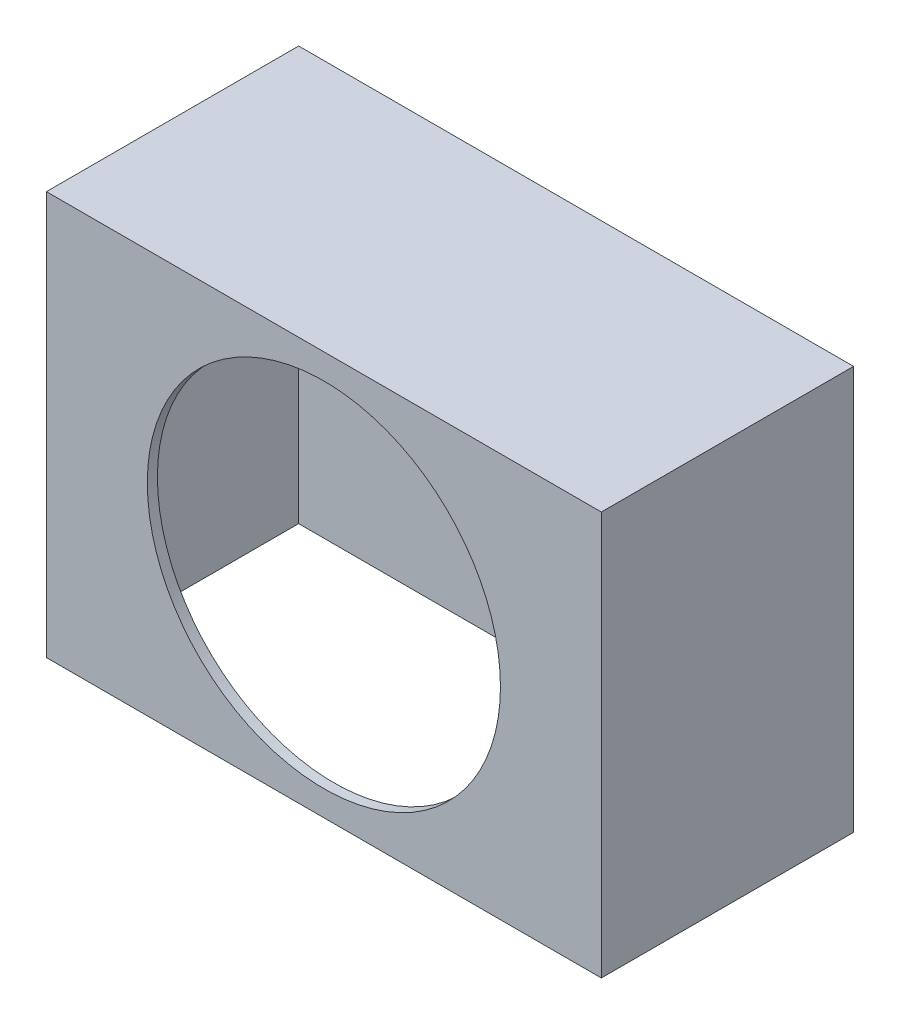
ISO-10303-21;
HEADER;
FILE_DESCRIPTION(('STEP AP214'),'2;1');
FILE_NAME('part.step','',(''),(''),'','','');
FILE_SCHEMA(('AUTOMOTIVE_DESIGN { 1 0 10303 214 1 1 1 1 }'));
ENDSEC;
DATA;
#1=APPLICATION_CONTEXT('core data for automotive mechanical design processes');
#2=APPLICATION_PROTOCOL_DEFINITION('international standard','automotive_design',2000,#1);
#3=PRODUCT_CONTEXT('',#1,'mechanical');
#4=PRODUCT('Part','Part','',(#3));
#5=PRODUCT_RELATED_PRODUCT_CATEGORY('part','',(#4));
#6=PRODUCT_DEFINITION_FORMATION('','',#4);
#7=PRODUCT_DEFINITION_CONTEXT('part definition',#1,'design');
#8=PRODUCT_DEFINITION('design','',#6,#7);
#9=PRODUCT_DEFINITION_SHAPE('','',#8);
#10=(LENGTH_UNIT() NAMED_UNIT(*) SI_UNIT(.MILLI.,.METRE.));
#11=(NAMED_UNIT(*) PLANE_ANGLE_UNIT() SI_UNIT($,.RADIAN.));
#12=(NAMED_UNIT(*) SI_UNIT($,.STERADIAN.) SOLID_ANGLE_UNIT());
#13=UNCERTAINTY_MEASURE_WITH_UNIT(LENGTH_MEASURE(1.E-05),#10,'distance_accuracy_value','');
#14=(GEOMETRIC_REPRESENTATION_CONTEXT(3) GLOBAL_UNCERTAINTY_ASSIGNED_CONTEXT((#13)) GLOBAL_UNIT_ASSIGNED_CONTEXT((#10,
#11,#12)) REPRESENTATION_CONTEXT('',''));
#15=CARTESIAN_POINT('',(0.,0.,0.));
#16=DIRECTION('',(0.,0.,1.));
#17=DIRECTION('',(1.,0.,0.));
#18=AXIS2_PLACEMENT_3D('',#15,#16,#17);
#19=CARTESIAN_POINT('',(-55.,80.,25.));
#20=DIRECTION('',(1.,0.,0.));
#21=DIRECTION('',(0.,0.,-1.));
#22=AXIS2_PLACEMENT_3D('',#19,#20,#21);
#23=PLANE('',#22);
#24=DIRECTION('',(0.,0.,1.));
#25=VECTOR('',#24,1.);
#26=CARTESIAN_POINT('',(-55.,0.,25.));
#27=LINE('',#26,#25);
#28=CARTESIAN_POINT('',(-55.,0.,-25.));
#29=VERTEX_POINT('',#28);
#30=CARTESIAN_POINT('',(-55.,0.,25.));
#31=VERTEX_POINT('',#30);
#32=EDGE_CURVE('E130',#29,#31,#27,.T.);
#33=ORIENTED_EDGE('',*,*,#32,.T.);
#34=DIRECTION('',(0.,-1.,0.));
#35=VECTOR('',#34,1.);
#36=CARTESIAN_POINT('',(-55.,80.,25.));
#37=LINE('',#36,#35);
#38=CARTESIAN_POINT('',(-55.,80.,25.));
#39=VERTEX_POINT('',#38);
#40=EDGE_CURVE('E11',#39,#31,#37,.T.);
#41=ORIENTED_EDGE('',*,*,#40,.F.);
#42=DIRECTION('',(0.,0.,1.));
#43=VECTOR('',#42,1.);
#44=CARTESIAN_POINT('',(-55.,80.,25.));
#45=LINE('',#44,#43);
#46=CARTESIAN_POINT('',(-55.,80.,-25.));
#47=VERTEX_POINT('',#46);
#48=EDGE_CURVE('E154',#47,#39,#45,.T.);
#49=ORIENTED_EDGE('',*,*,#48,.F.);
#50=DIRECTION('',(0.,-1.,0.));
#51=VECTOR('',#50,1.);
#52=CARTESIAN_POINT('',(-55.,80.,-25.));
#53=LINE('',#52,#51);
#54=EDGE_CURVE('E159',#47,#29,#53,.T.);
#55=ORIENTED_EDGE('',*,*,#54,.T.);
#56=EDGE_LOOP('',(#33,#41,#49,#55));
#57=FACE_BOUND('',#56,.T.);
#58=ADVANCED_FACE('F34',(#57),#23,.F.);
#59=CARTESIAN_POINT('',(55.,80.,25.));
#60=DIRECTION('',(0.,0.,-1.));
#61=DIRECTION('',(-1.,0.,0.));
#62=AXIS2_PLACEMENT_3D('',#59,#60,#61);
#63=PLANE('',#62);
#64=CARTESIAN_POINT('',(0.,40.,25.));
#65=DIRECTION('',(0.,0.,1.));
#66=DIRECTION('',(1.,0.,0.));
#67=AXIS2_PLACEMENT_3D('',#64,#65,#66);
#68=CIRCLE('',#67,35.);
#69=CARTESIAN_POINT('',(35.,40.,25.));
#70=VERTEX_POINT('',#69);
#71=EDGE_CURVE('E139',#70,#70,#68,.T.);
#72=ORIENTED_EDGE('',*,*,#71,.F.);
#73=EDGE_LOOP('',(#72));
#74=FACE_BOUND('',#73,.T.);
#75=DIRECTION('',(1.,0.,0.));
#76=VECTOR('',#75,1.);
#77=CARTESIAN_POINT('',(55.,0.,25.));
#78=LINE('',#77,#76);
#79=CARTESIAN_POINT('',(55.,0.,25.));
#80=VERTEX_POINT('',#79);
#81=EDGE_CURVE('E134',#31,#80,#78,.T.);
#82=ORIENTED_EDGE('',*,*,#81,.T.);
#83=DIRECTION('',(0.,-1.,0.));
#84=VECTOR('',#83,1.);
#85=CARTESIAN_POINT('',(55.,80.,25.));
#86=LINE('',#85,#84);
#87=CARTESIAN_POINT('',(55.,80.,25.));
#88=VERTEX_POINT('',#87);
#89=EDGE_CURVE('E41',#88,#80,#86,.T.);
#90=ORIENTED_EDGE('',*,*,#89,.F.);
#91=DIRECTION('',(1.,0.,0.));
#92=VECTOR('',#91,1.);
#93=CARTESIAN_POINT('',(55.,80.,25.));
#94=LINE('',#93,#92);
#95=EDGE_CURVE('E85',#39,#88,#94,.T.);
#96=ORIENTED_EDGE('',*,*,#95,.F.);
#97=ORIENTED_EDGE('',*,*,#40,.T.);
#98=EDGE_LOOP('',(#82,#90,#96,#97));
#99=FACE_BOUND('',#98,.T.);
#100=ADVANCED_FACE('F188',(#74,#99),#63,.F.);
#101=CARTESIAN_POINT('',(55.,80.,25.));
#102=DIRECTION('',(-1.,0.,0.));
#103=DIRECTION('',(0.,0.,1.));
#104=AXIS2_PLACEMENT_3D('',#101,#102,#103);
#105=PLANE('',#104);
#106=DIRECTION('',(0.,0.,-1.));
#107=VECTOR('',#106,1.);
#108=CARTESIAN_POINT('',(55.,0.,25.));
#109=LINE('',#108,#107);
#110=CARTESIAN_POINT('',(55.,0.,-25.));
#111=VERTEX_POINT('',#110);
#112=EDGE_CURVE('E162',#80,#111,#109,.T.);
#113=ORIENTED_EDGE('',*,*,#112,.T.);
#114=DIRECTION('',(0.,-1.,0.));
#115=VECTOR('',#114,1.);
#116=CARTESIAN_POINT('',(55.,80.,-25.));
#117=LINE('',#116,#115);
#118=CARTESIAN_POINT('',(55.,80.,-25.));
#119=VERTEX_POINT('',#118);
#120=EDGE_CURVE('E166',#119,#111,#117,.T.);
#121=ORIENTED_EDGE('',*,*,#120,.F.);
#122=DIRECTION('',(0.,0.,-1.));
#123=VECTOR('',#122,1.);
#124=CARTESIAN_POINT('',(55.,80.,25.));
#125=LINE('',#124,#123);
#126=EDGE_CURVE('E157',#88,#119,#125,.T.);
#127=ORIENTED_EDGE('',*,*,#126,.F.);
#128=ORIENTED_EDGE('',*,*,#89,.T.);
#129=EDGE_LOOP('',(#113,#121,#127,#128));
#130=FACE_BOUND('',#129,.T.);
#131=ADVANCED_FACE('F171',(#130),#105,.F.);
#132=CARTESIAN_POINT('',(55.,80.,-25.));
#133=DIRECTION('',(0.,0.,1.));
#134=DIRECTION('',(1.,0.,0.));
#135=AXIS2_PLACEMENT_3D('',#132,#133,#134);
#136=PLANE('',#135);
#137=DIRECTION('',(-1.,0.,0.));
#138=VECTOR('',#137,1.);
#139=CARTESIAN_POINT('',(55.,0.,-25.));
#140=LINE('',#139,#138);
#141=EDGE_CURVE('E78',#111,#29,#140,.T.);
#142=ORIENTED_EDGE('',*,*,#141,.T.);
#143=ORIENTED_EDGE('',*,*,#54,.F.);
#144=DIRECTION('',(-1.,0.,0.));
#145=VECTOR('',#144,1.);
#146=CARTESIAN_POINT('',(55.,80.,-25.));
#147=LINE('',#146,#145);
#148=EDGE_CURVE('E57',#119,#47,#147,.T.);
#149=ORIENTED_EDGE('',*,*,#148,.F.);
#150=ORIENTED_EDGE('',*,*,#120,.T.);
#151=EDGE_LOOP('',(#142,#143,#149,#150));
#152=FACE_BOUND('',#151,.T.);
#153=ADVANCED_FACE('F179',(#152),#136,.F.);
#154=CARTESIAN_POINT('',(0.,80.,0.));
#155=DIRECTION('',(0.,1.,0.));
#156=DIRECTION('',(0.,0.,1.));
#157=AXIS2_PLACEMENT_3D('',#154,#155,#156);
#158=PLANE('',#157);
#159=ORIENTED_EDGE('',*,*,#48,.T.);
#160=ORIENTED_EDGE('',*,*,#95,.T.);
#161=ORIENTED_EDGE('',*,*,#126,.T.);
#162=ORIENTED_EDGE('',*,*,#148,.T.);
#163=EDGE_LOOP('',(#159,#160,#161,#162));
#164=FACE_BOUND('',#163,.T.);
#165=ADVANCED_FACE('F181',(#164),#158,.T.);
#166=CARTESIAN_POINT('',(0.,0.,0.));
#167=DIRECTION('',(0.,1.,0.));
#168=DIRECTION('',(0.,0.,1.));
#169=AXIS2_PLACEMENT_3D('',#166,#167,#168);
#170=PLANE('',#169);
#171=DIRECTION('',(-1.,0.,0.));
#172=VECTOR('',#171,1.);
#173=CARTESIAN_POINT('',(55.,0.,-23.));
#174=LINE('',#173,#172);
#175=CARTESIAN_POINT('',(53.,0.,-23.));
#176=VERTEX_POINT('',#175);
#177=CARTESIAN_POINT('',(-53.,0.,-23.));
#178=VERTEX_POINT('',#177);
#179=EDGE_CURVE('E125',#176,#178,#174,.T.);
#180=ORIENTED_EDGE('',*,*,#179,.T.);
#181=DIRECTION('',(0.,0.,1.));
#182=VECTOR('',#181,1.);
#183=CARTESIAN_POINT('',(-53.,0.,25.));
#184=LINE('',#183,#182);
#185=CARTESIAN_POINT('',(-53.,0.,23.));
#186=VERTEX_POINT('',#185);
#187=EDGE_CURVE('E147',#178,#186,#184,.T.);
#188=ORIENTED_EDGE('',*,*,#187,.T.);
#189=DIRECTION('',(1.,0.,0.));
#190=VECTOR('',#189,1.);
#191=CARTESIAN_POINT('',(55.,0.,23.));
#192=LINE('',#191,#190);
#193=CARTESIAN_POINT('',(53.,0.,23.));
#194=VERTEX_POINT('',#193);
#195=EDGE_CURVE('E129',#186,#194,#192,.T.);
#196=ORIENTED_EDGE('',*,*,#195,.T.);
#197=DIRECTION('',(0.,0.,-1.));
#198=VECTOR('',#197,1.);
#199=CARTESIAN_POINT('',(53.,0.,25.));
#200=LINE('',#199,#198);
#201=EDGE_CURVE('E48',#194,#176,#200,.T.);
#202=ORIENTED_EDGE('',*,*,#201,.T.);
#203=EDGE_LOOP('',(#180,#188,#196,#202));
#204=FACE_BOUND('',#203,.T.);
#205=ORIENTED_EDGE('',*,*,#32,.F.);
#206=ORIENTED_EDGE('',*,*,#141,.F.);
#207=ORIENTED_EDGE('',*,*,#112,.F.);
#208=ORIENTED_EDGE('',*,*,#81,.F.);
#209=EDGE_LOOP('',(#205,#206,#207,#208));
#210=FACE_BOUND('',#209,.T.);
#211=ADVANCED_FACE('F175',(#204,#210),#170,.F.);
#212=CARTESIAN_POINT('',(-53.,80.,25.));
#213=DIRECTION('',(1.,0.,0.));
#214=DIRECTION('',(0.,0.,-1.));
#215=AXIS2_PLACEMENT_3D('',#212,#213,#214);
#216=PLANE('',#215);
#217=ORIENTED_EDGE('',*,*,#187,.F.);
#218=DIRECTION('',(0.,-1.,0.));
#219=VECTOR('',#218,1.);
#220=CARTESIAN_POINT('',(-53.,80.,-23.));
#221=LINE('',#220,#219);
#222=CARTESIAN_POINT('',(-53.,78.,-23.));
#223=VERTEX_POINT('',#222);
#224=EDGE_CURVE('E124',#223,#178,#221,.T.);
#225=ORIENTED_EDGE('',*,*,#224,.F.);
#226=DIRECTION('',(0.,0.,1.));
#227=VECTOR('',#226,1.);
#228=CARTESIAN_POINT('',(-53.,78.,25.));
#229=LINE('',#228,#227);
#230=CARTESIAN_POINT('',(-53.,78.,23.));
#231=VERTEX_POINT('',#230);
#232=EDGE_CURVE('E112',#223,#231,#229,.T.);
#233=ORIENTED_EDGE('',*,*,#232,.T.);
#234=DIRECTION('',(0.,-1.,0.));
#235=VECTOR('',#234,1.);
#236=CARTESIAN_POINT('',(-53.,80.,23.));
#237=LINE('',#236,#235);
#238=EDGE_CURVE('E122',#231,#186,#237,.T.);
#239=ORIENTED_EDGE('',*,*,#238,.T.);
#240=EDGE_LOOP('',(#217,#225,#233,#239));
#241=FACE_BOUND('',#240,.T.);
#242=ADVANCED_FACE('F121',(#241),#216,.T.);
#243=CARTESIAN_POINT('',(55.,80.,23.));
#244=DIRECTION('',(0.,0.,-1.));
#245=DIRECTION('',(-1.,0.,0.));
#246=AXIS2_PLACEMENT_3D('',#243,#244,#245);
#247=PLANE('',#246);
#248=CARTESIAN_POINT('',(0.,40.,23.));
#249=DIRECTION('',(0.,0.,1.));
#250=DIRECTION('',(1.,0.,0.));
#251=AXIS2_PLACEMENT_3D('',#248,#249,#250);
#252=CIRCLE('',#251,35.);
#253=CARTESIAN_POINT('',(35.,40.,23.));
#254=VERTEX_POINT('',#253);
#255=EDGE_CURVE('E149',#254,#254,#252,.T.);
#256=ORIENTED_EDGE('',*,*,#255,.T.);
#257=EDGE_LOOP('',(#256));
#258=FACE_BOUND('',#257,.T.);
#259=ORIENTED_EDGE('',*,*,#195,.F.);
#260=ORIENTED_EDGE('',*,*,#238,.F.);
#261=DIRECTION('',(1.,0.,0.));
#262=VECTOR('',#261,1.);
#263=CARTESIAN_POINT('',(55.,78.,23.));
#264=LINE('',#263,#262);
#265=CARTESIAN_POINT('',(53.,78.,23.));
#266=VERTEX_POINT('',#265);
#267=EDGE_CURVE('E108',#231,#266,#264,.T.);
#268=ORIENTED_EDGE('',*,*,#267,.T.);
#269=DIRECTION('',(0.,-1.,0.));
#270=VECTOR('',#269,1.);
#271=CARTESIAN_POINT('',(53.,80.,23.));
#272=LINE('',#271,#270);
#273=EDGE_CURVE('E131',#266,#194,#272,.T.);
#274=ORIENTED_EDGE('',*,*,#273,.T.);
#275=EDGE_LOOP('',(#259,#260,#268,#274));
#276=FACE_BOUND('',#275,.T.);
#277=ADVANCED_FACE('F127',(#258,#276),#247,.T.);
#278=CARTESIAN_POINT('',(53.,80.,25.));
#279=DIRECTION('',(-1.,0.,0.));
#280=DIRECTION('',(0.,0.,1.));
#281=AXIS2_PLACEMENT_3D('',#278,#279,#280);
#282=PLANE('',#281);
#283=ORIENTED_EDGE('',*,*,#201,.F.);
#284=ORIENTED_EDGE('',*,*,#273,.F.);
#285=DIRECTION('',(0.,0.,-1.));
#286=VECTOR('',#285,1.);
#287=CARTESIAN_POINT('',(53.,78.,25.));
#288=LINE('',#287,#286);
#289=CARTESIAN_POINT('',(53.,78.,-23.));
#290=VERTEX_POINT('',#289);
#291=EDGE_CURVE('E113',#266,#290,#288,.T.);
#292=ORIENTED_EDGE('',*,*,#291,.T.);
#293=DIRECTION('',(0.,-1.,0.));
#294=VECTOR('',#293,1.);
#295=CARTESIAN_POINT('',(53.,80.,-23.));
#296=LINE('',#295,#294);
#297=EDGE_CURVE('E136',#290,#176,#296,.T.);
#298=ORIENTED_EDGE('',*,*,#297,.T.);
#299=EDGE_LOOP('',(#283,#284,#292,#298));
#300=FACE_BOUND('',#299,.T.);
#301=ADVANCED_FACE('F218',(#300),#282,.T.);
#302=CARTESIAN_POINT('',(55.,80.,-23.));
#303=DIRECTION('',(0.,0.,1.));
#304=DIRECTION('',(1.,0.,0.));
#305=AXIS2_PLACEMENT_3D('',#302,#303,#304);
#306=PLANE('',#305);
#307=ORIENTED_EDGE('',*,*,#179,.F.);
#308=ORIENTED_EDGE('',*,*,#297,.F.);
#309=DIRECTION('',(-1.,0.,0.));
#310=VECTOR('',#309,1.);
#311=CARTESIAN_POINT('',(55.,78.,-23.));
#312=LINE('',#311,#310);
#313=EDGE_CURVE('E142',#290,#223,#312,.T.);
#314=ORIENTED_EDGE('',*,*,#313,.T.);
#315=ORIENTED_EDGE('',*,*,#224,.T.);
#316=EDGE_LOOP('',(#307,#308,#314,#315));
#317=FACE_BOUND('',#316,.T.);
#318=ADVANCED_FACE('F211',(#317),#306,.T.);
#319=CARTESIAN_POINT('',(0.,78.,0.));
#320=DIRECTION('',(0.,1.,0.));
#321=DIRECTION('',(0.,0.,1.));
#322=AXIS2_PLACEMENT_3D('',#319,#320,#321);
#323=PLANE('',#322);
#324=ORIENTED_EDGE('',*,*,#232,.F.);
#325=ORIENTED_EDGE('',*,*,#313,.F.);
#326=ORIENTED_EDGE('',*,*,#291,.F.);
#327=ORIENTED_EDGE('',*,*,#267,.F.);
#328=EDGE_LOOP('',(#324,#325,#326,#327));
#329=FACE_BOUND('',#328,.T.);
#330=ADVANCED_FACE('F110',(#329),#323,.F.);
#331=CARTESIAN_POINT('',(0.,40.,23.));
#332=DIRECTION('',(0.,0.,1.));
#333=DIRECTION('',(1.,0.,0.));
#334=AXIS2_PLACEMENT_3D('',#331,#332,#333);
#335=CYLINDRICAL_SURFACE('',#334,35.);
#336=ORIENTED_EDGE('',*,*,#255,.F.);
#337=EDGE_LOOP('',(#336));
#338=FACE_BOUND('',#337,.T.);
#339=ORIENTED_EDGE('',*,*,#71,.T.);
#340=EDGE_LOOP('',(#339));
#341=FACE_BOUND('',#340,.T.);
#342=ADVANCED_FACE('F205',(#338,#341),#335,.F.);
#343=CLOSED_SHELL('',(#58,#100,#131,#153,#165,#211,#242,#277,#301,#318,#330,#342));
#344=MANIFOLD_SOLID_BREP('B2',#343);
#345=ADVANCED_BREP_SHAPE_REPRESENTATION('',(#18,#344),#14);
#346=SHAPE_DEFINITION_REPRESENTATION(#9,#345);
ENDSEC;
END-ISO-10303-21;
